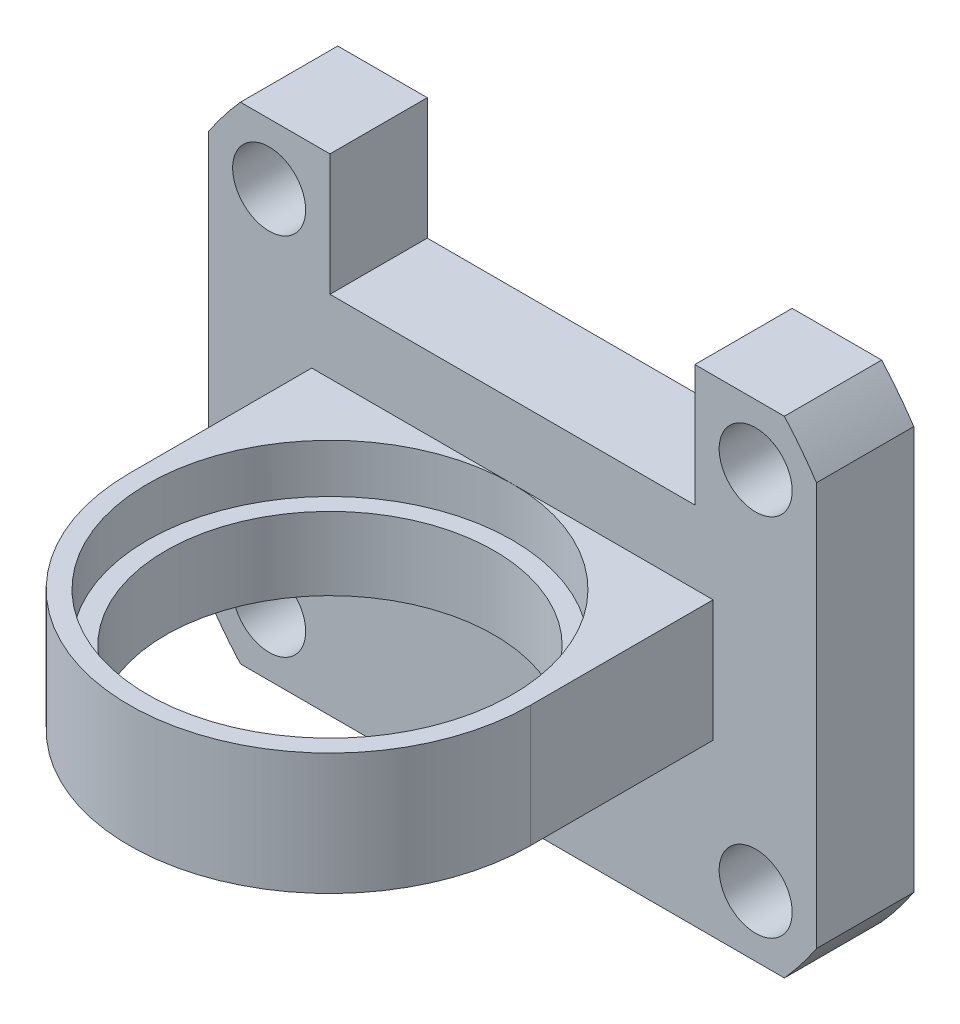
ISO-10303-21;
HEADER;
FILE_DESCRIPTION(('STEP AP214'),'2;1');
FILE_NAME('part.step','',(''),(''),'','','');
FILE_SCHEMA(('AUTOMOTIVE_DESIGN { 1 0 10303 214 1 1 1 1 }'));
ENDSEC;
DATA;
#1=APPLICATION_CONTEXT('core data for automotive mechanical design processes');
#2=APPLICATION_PROTOCOL_DEFINITION('international standard','automotive_design',2000,#1);
#3=PRODUCT_CONTEXT('',#1,'mechanical');
#4=PRODUCT('Part','Part','',(#3));
#5=PRODUCT_RELATED_PRODUCT_CATEGORY('part','',(#4));
#6=PRODUCT_DEFINITION_FORMATION('','',#4);
#7=PRODUCT_DEFINITION_CONTEXT('part definition',#1,'design');
#8=PRODUCT_DEFINITION('design','',#6,#7);
#9=PRODUCT_DEFINITION_SHAPE('','',#8);
#10=(LENGTH_UNIT() NAMED_UNIT(*) SI_UNIT(.MILLI.,.METRE.));
#11=(NAMED_UNIT(*) PLANE_ANGLE_UNIT() SI_UNIT($,.RADIAN.));
#12=(NAMED_UNIT(*) SI_UNIT($,.STERADIAN.) SOLID_ANGLE_UNIT());
#13=UNCERTAINTY_MEASURE_WITH_UNIT(LENGTH_MEASURE(1.E-05),#10,'distance_accuracy_value','');
#14=(GEOMETRIC_REPRESENTATION_CONTEXT(3) GLOBAL_UNCERTAINTY_ASSIGNED_CONTEXT((#13)) GLOBAL_UNIT_ASSIGNED_CONTEXT((#10,
#11,#12)) REPRESENTATION_CONTEXT('',''));
#15=CARTESIAN_POINT('',(0.,0.,0.));
#16=DIRECTION('',(0.,0.,1.));
#17=DIRECTION('',(1.,0.,0.));
#18=AXIS2_PLACEMENT_3D('',#15,#16,#17);
#19=CARTESIAN_POINT('',(0.,0.,8.));
#20=DIRECTION('',(0.,0.,1.));
#21=DIRECTION('',(1.,0.,0.));
#22=AXIS2_PLACEMENT_3D('',#19,#20,#21);
#23=PLANE('',#22);
#24=CARTESIAN_POINT('',(20.,15.,8.));
#25=DIRECTION('',(0.,0.,1.));
#26=DIRECTION('',(1.,0.,0.));
#27=AXIS2_PLACEMENT_3D('',#24,#25,#26);
#28=CIRCLE('',#27,3.);
#29=CARTESIAN_POINT('',(23.,15.,8.));
#30=VERTEX_POINT('',#29);
#31=EDGE_CURVE('E303',#30,#30,#28,.T.);
#32=ORIENTED_EDGE('',*,*,#31,.F.);
#33=EDGE_LOOP('',(#32));
#34=FACE_BOUND('',#33,.T.);
#35=CARTESIAN_POINT('',(20.,-15.,8.));
#36=DIRECTION('',(0.,0.,1.));
#37=DIRECTION('',(1.,0.,0.));
#38=AXIS2_PLACEMENT_3D('',#35,#36,#37);
#39=CIRCLE('',#38,3.);
#40=CARTESIAN_POINT('',(23.,-15.,8.));
#41=VERTEX_POINT('',#40);
#42=EDGE_CURVE('E308',#41,#41,#39,.T.);
#43=ORIENTED_EDGE('',*,*,#42,.F.);
#44=EDGE_LOOP('',(#43));
#45=FACE_BOUND('',#44,.T.);
#46=CARTESIAN_POINT('',(-20.,-15.,8.));
#47=DIRECTION('',(0.,0.,1.));
#48=DIRECTION('',(1.,0.,0.));
#49=AXIS2_PLACEMENT_3D('',#46,#47,#48);
#50=CIRCLE('',#49,3.);
#51=CARTESIAN_POINT('',(-17.,-15.,8.));
#52=VERTEX_POINT('',#51);
#53=EDGE_CURVE('E304',#52,#52,#50,.T.);
#54=ORIENTED_EDGE('',*,*,#53,.F.);
#55=EDGE_LOOP('',(#54));
#56=FACE_BOUND('',#55,.T.);
#57=CARTESIAN_POINT('',(-20.,15.,8.));
#58=DIRECTION('',(0.,0.,1.));
#59=DIRECTION('',(1.,0.,0.));
#60=AXIS2_PLACEMENT_3D('',#57,#58,#59);
#61=CIRCLE('',#60,3.);
#62=CARTESIAN_POINT('',(-17.,15.,8.));
#63=VERTEX_POINT('',#62);
#64=EDGE_CURVE('E241',#63,#63,#61,.T.);
#65=ORIENTED_EDGE('',*,*,#64,.F.);
#66=EDGE_LOOP('',(#65));
#67=FACE_BOUND('',#66,.T.);
#68=DIRECTION('',(-1.,0.,0.));
#69=VECTOR('',#68,1.);
#70=CARTESIAN_POINT('',(0.,-6.,8.));
#71=LINE('',#70,#69);
#72=CARTESIAN_POINT('',(16.5,-6.,8.));
#73=VERTEX_POINT('',#72);
#74=CARTESIAN_POINT('',(-16.5,-6.,8.));
#75=VERTEX_POINT('',#74);
#76=EDGE_CURVE('E256',#73,#75,#71,.T.);
#77=ORIENTED_EDGE('',*,*,#76,.T.);
#78=DIRECTION('',(0.,-1.,0.));
#79=VECTOR('',#78,1.);
#80=CARTESIAN_POINT('',(-16.5,0.,8.));
#81=LINE('',#80,#79);
#82=CARTESIAN_POINT('',(-16.5,4.,8.));
#83=VERTEX_POINT('',#82);
#84=EDGE_CURVE('E250',#83,#75,#81,.T.);
#85=ORIENTED_EDGE('',*,*,#84,.F.);
#86=DIRECTION('',(-1.,0.,0.));
#87=VECTOR('',#86,1.);
#88=CARTESIAN_POINT('',(0.,4.,8.));
#89=LINE('',#88,#87);
#90=CARTESIAN_POINT('',(0.,4.,8.));
#91=VERTEX_POINT('',#90);
#92=EDGE_CURVE('E253',#91,#83,#89,.T.);
#93=ORIENTED_EDGE('',*,*,#92,.F.);
#94=CARTESIAN_POINT('',(16.5,4.,8.));
#95=VERTEX_POINT('',#94);
#96=EDGE_CURVE('E255',#95,#91,#89,.T.);
#97=ORIENTED_EDGE('',*,*,#96,.F.);
#98=DIRECTION('',(0.,1.,0.));
#99=VECTOR('',#98,1.);
#100=CARTESIAN_POINT('',(16.5,0.,8.));
#101=LINE('',#100,#99);
#102=EDGE_CURVE('E235',#73,#95,#101,.T.);
#103=ORIENTED_EDGE('',*,*,#102,.F.);
#104=EDGE_LOOP('',(#77,#85,#93,#97,#103));
#105=FACE_BOUND('',#104,.T.);
#106=CARTESIAN_POINT('',(0.,0.,8.));
#107=DIRECTION('',(0.,0.,1.));
#108=DIRECTION('',(1.,0.,0.));
#109=AXIS2_PLACEMENT_3D('',#106,#107,#108);
#110=CIRCLE('',#109,30.);
#111=CARTESIAN_POINT('',(25.,-16.583123951777,8.));
#112=VERTEX_POINT('',#111);
#113=CARTESIAN_POINT('',(22.3606797749979,-20.,8.));
#114=VERTEX_POINT('',#113);
#115=EDGE_CURVE('E346',#112,#114,#110,.F.);
#116=ORIENTED_EDGE('',*,*,#115,.F.);
#117=DIRECTION('',(0.,1.,0.));
#118=VECTOR('',#117,1.);
#119=CARTESIAN_POINT('',(25.,-20.,8.));
#120=LINE('',#119,#118);
#121=CARTESIAN_POINT('',(25.,16.583123951777,8.));
#122=VERTEX_POINT('',#121);
#123=EDGE_CURVE('E197',#112,#122,#120,.T.);
#124=ORIENTED_EDGE('',*,*,#123,.T.);
#125=CARTESIAN_POINT('',(22.3606797749979,20.,8.));
#126=VERTEX_POINT('',#125);
#127=EDGE_CURVE('E180',#126,#122,#110,.F.);
#128=ORIENTED_EDGE('',*,*,#127,.F.);
#129=DIRECTION('',(-1.,0.,0.));
#130=VECTOR('',#129,1.);
#131=CARTESIAN_POINT('',(15.,20.,8.));
#132=LINE('',#131,#130);
#133=CARTESIAN_POINT('',(15.,20.,8.));
#134=VERTEX_POINT('',#133);
#135=EDGE_CURVE('E177',#126,#134,#132,.T.);
#136=ORIENTED_EDGE('',*,*,#135,.T.);
#137=DIRECTION('',(0.,-1.,0.));
#138=VECTOR('',#137,1.);
#139=CARTESIAN_POINT('',(15.,10.,8.));
#140=LINE('',#139,#138);
#141=CARTESIAN_POINT('',(15.,10.,8.));
#142=VERTEX_POINT('',#141);
#143=EDGE_CURVE('E320',#134,#142,#140,.T.);
#144=ORIENTED_EDGE('',*,*,#143,.T.);
#145=DIRECTION('',(-1.,0.,0.));
#146=VECTOR('',#145,1.);
#147=CARTESIAN_POINT('',(-15.,10.,8.));
#148=LINE('',#147,#146);
#149=CARTESIAN_POINT('',(-15.,10.,8.));
#150=VERTEX_POINT('',#149);
#151=EDGE_CURVE('E323',#142,#150,#148,.T.);
#152=ORIENTED_EDGE('',*,*,#151,.T.);
#153=DIRECTION('',(0.,1.,0.));
#154=VECTOR('',#153,1.);
#155=CARTESIAN_POINT('',(-15.,20.,8.));
#156=LINE('',#155,#154);
#157=CARTESIAN_POINT('',(-15.,20.,8.));
#158=VERTEX_POINT('',#157);
#159=EDGE_CURVE('E326',#150,#158,#156,.T.);
#160=ORIENTED_EDGE('',*,*,#159,.T.);
#161=DIRECTION('',(-1.,0.,0.));
#162=VECTOR('',#161,1.);
#163=CARTESIAN_POINT('',(-25.,20.,8.));
#164=LINE('',#163,#162);
#165=CARTESIAN_POINT('',(-22.3606797749979,20.,8.));
#166=VERTEX_POINT('',#165);
#167=EDGE_CURVE('E329',#158,#166,#164,.T.);
#168=ORIENTED_EDGE('',*,*,#167,.T.);
#169=CARTESIAN_POINT('',(-25.,16.583123951777,8.));
#170=VERTEX_POINT('',#169);
#171=EDGE_CURVE('E369',#170,#166,#110,.F.);
#172=ORIENTED_EDGE('',*,*,#171,.F.);
#173=DIRECTION('',(0.,-1.,0.));
#174=VECTOR('',#173,1.);
#175=CARTESIAN_POINT('',(-25.,-20.,8.));
#176=LINE('',#175,#174);
#177=CARTESIAN_POINT('',(-25.,-16.583123951777,8.));
#178=VERTEX_POINT('',#177);
#179=EDGE_CURVE('E333',#170,#178,#176,.T.);
#180=ORIENTED_EDGE('',*,*,#179,.T.);
#181=CARTESIAN_POINT('',(-22.3606797749979,-20.,8.));
#182=VERTEX_POINT('',#181);
#183=EDGE_CURVE('E356',#182,#178,#110,.F.);
#184=ORIENTED_EDGE('',*,*,#183,.F.);
#185=DIRECTION('',(1.,0.,0.));
#186=VECTOR('',#185,1.);
#187=CARTESIAN_POINT('',(-25.,-20.,8.));
#188=LINE('',#187,#186);
#189=EDGE_CURVE('E336',#182,#114,#188,.T.);
#190=ORIENTED_EDGE('',*,*,#189,.T.);
#191=EDGE_LOOP('',(#116,#124,#128,#136,#144,#152,#160,#168,#172,#180,#184,#190));
#192=FACE_BOUND('',#191,.T.);
#193=ADVANCED_FACE('F41',(#34,#45,#56,#67,#105,#192),#23,.T.);
#194=CARTESIAN_POINT('',(0.,0.,0.));
#195=DIRECTION('',(0.,0.,1.));
#196=DIRECTION('',(1.,0.,0.));
#197=AXIS2_PLACEMENT_3D('',#194,#195,#196);
#198=PLANE('',#197);
#199=CARTESIAN_POINT('',(20.,15.,0.));
#200=DIRECTION('',(0.,0.,1.));
#201=DIRECTION('',(1.,0.,0.));
#202=AXIS2_PLACEMENT_3D('',#199,#200,#201);
#203=CIRCLE('',#202,3.);
#204=CARTESIAN_POINT('',(23.,15.,0.));
#205=VERTEX_POINT('',#204);
#206=EDGE_CURVE('E187',#205,#205,#203,.T.);
#207=ORIENTED_EDGE('',*,*,#206,.T.);
#208=EDGE_LOOP('',(#207));
#209=FACE_BOUND('',#208,.T.);
#210=CARTESIAN_POINT('',(20.,-15.,0.));
#211=DIRECTION('',(0.,0.,1.));
#212=DIRECTION('',(1.,0.,0.));
#213=AXIS2_PLACEMENT_3D('',#210,#211,#212);
#214=CIRCLE('',#213,3.);
#215=CARTESIAN_POINT('',(23.,-15.,0.));
#216=VERTEX_POINT('',#215);
#217=EDGE_CURVE('E194',#216,#216,#214,.T.);
#218=ORIENTED_EDGE('',*,*,#217,.T.);
#219=EDGE_LOOP('',(#218));
#220=FACE_BOUND('',#219,.T.);
#221=CARTESIAN_POINT('',(-20.,-15.,0.));
#222=DIRECTION('',(0.,0.,1.));
#223=DIRECTION('',(1.,0.,0.));
#224=AXIS2_PLACEMENT_3D('',#221,#222,#223);
#225=CIRCLE('',#224,3.);
#226=CARTESIAN_POINT('',(-17.,-15.,0.));
#227=VERTEX_POINT('',#226);
#228=EDGE_CURVE('E240',#227,#227,#225,.T.);
#229=ORIENTED_EDGE('',*,*,#228,.T.);
#230=EDGE_LOOP('',(#229));
#231=FACE_BOUND('',#230,.T.);
#232=CARTESIAN_POINT('',(-20.,15.,0.));
#233=DIRECTION('',(0.,0.,1.));
#234=DIRECTION('',(1.,0.,0.));
#235=AXIS2_PLACEMENT_3D('',#232,#233,#234);
#236=CIRCLE('',#235,3.);
#237=CARTESIAN_POINT('',(-17.,15.,0.));
#238=VERTEX_POINT('',#237);
#239=EDGE_CURVE('E236',#238,#238,#236,.T.);
#240=ORIENTED_EDGE('',*,*,#239,.T.);
#241=EDGE_LOOP('',(#240));
#242=FACE_BOUND('',#241,.T.);
#243=DIRECTION('',(0.,1.,0.));
#244=VECTOR('',#243,1.);
#245=CARTESIAN_POINT('',(25.,-20.,0.));
#246=LINE('',#245,#244);
#247=CARTESIAN_POINT('',(25.,-16.583123951777,0.));
#248=VERTEX_POINT('',#247);
#249=CARTESIAN_POINT('',(25.,16.583123951777,0.));
#250=VERTEX_POINT('',#249);
#251=EDGE_CURVE('E217',#248,#250,#246,.T.);
#252=ORIENTED_EDGE('',*,*,#251,.F.);
#253=CARTESIAN_POINT('',(0.,0.,0.));
#254=DIRECTION('',(0.,0.,1.));
#255=DIRECTION('',(1.,0.,0.));
#256=AXIS2_PLACEMENT_3D('',#253,#254,#255);
#257=CIRCLE('',#256,30.);
#258=CARTESIAN_POINT('',(22.3606797749979,-20.,0.));
#259=VERTEX_POINT('',#258);
#260=EDGE_CURVE('E12',#248,#259,#257,.F.);
#261=ORIENTED_EDGE('',*,*,#260,.T.);
#262=DIRECTION('',(1.,0.,0.));
#263=VECTOR('',#262,1.);
#264=CARTESIAN_POINT('',(-25.,-20.,0.));
#265=LINE('',#264,#263);
#266=CARTESIAN_POINT('',(-22.3606797749979,-20.,0.));
#267=VERTEX_POINT('',#266);
#268=EDGE_CURVE('E213',#267,#259,#265,.T.);
#269=ORIENTED_EDGE('',*,*,#268,.F.);
#270=CARTESIAN_POINT('',(-25.,-16.583123951777,0.));
#271=VERTEX_POINT('',#270);
#272=EDGE_CURVE('E50',#267,#271,#257,.F.);
#273=ORIENTED_EDGE('',*,*,#272,.T.);
#274=DIRECTION('',(0.,-1.,0.));
#275=VECTOR('',#274,1.);
#276=CARTESIAN_POINT('',(-25.,-20.,0.));
#277=LINE('',#276,#275);
#278=CARTESIAN_POINT('',(-25.,16.583123951777,0.));
#279=VERTEX_POINT('',#278);
#280=EDGE_CURVE('E209',#279,#271,#277,.T.);
#281=ORIENTED_EDGE('',*,*,#280,.F.);
#282=CARTESIAN_POINT('',(-22.3606797749979,20.,0.));
#283=VERTEX_POINT('',#282);
#284=EDGE_CURVE('E51',#279,#283,#257,.F.);
#285=ORIENTED_EDGE('',*,*,#284,.T.);
#286=DIRECTION('',(-1.,0.,0.));
#287=VECTOR('',#286,1.);
#288=CARTESIAN_POINT('',(-25.,20.,0.));
#289=LINE('',#288,#287);
#290=CARTESIAN_POINT('',(-15.,20.,0.));
#291=VERTEX_POINT('',#290);
#292=EDGE_CURVE('E205',#291,#283,#289,.T.);
#293=ORIENTED_EDGE('',*,*,#292,.F.);
#294=DIRECTION('',(0.,1.,0.));
#295=VECTOR('',#294,1.);
#296=CARTESIAN_POINT('',(-15.,20.,0.));
#297=LINE('',#296,#295);
#298=CARTESIAN_POINT('',(-15.,10.,0.));
#299=VERTEX_POINT('',#298);
#300=EDGE_CURVE('E202',#299,#291,#297,.T.);
#301=ORIENTED_EDGE('',*,*,#300,.F.);
#302=DIRECTION('',(-1.,0.,0.));
#303=VECTOR('',#302,1.);
#304=CARTESIAN_POINT('',(-15.,10.,0.));
#305=LINE('',#304,#303);
#306=CARTESIAN_POINT('',(15.,10.,0.));
#307=VERTEX_POINT('',#306);
#308=EDGE_CURVE('E191',#307,#299,#305,.T.);
#309=ORIENTED_EDGE('',*,*,#308,.F.);
#310=DIRECTION('',(0.,-1.,0.));
#311=VECTOR('',#310,1.);
#312=CARTESIAN_POINT('',(15.,10.,0.));
#313=LINE('',#312,#311);
#314=CARTESIAN_POINT('',(15.,20.,0.));
#315=VERTEX_POINT('',#314);
#316=EDGE_CURVE('E184',#315,#307,#313,.T.);
#317=ORIENTED_EDGE('',*,*,#316,.F.);
#318=DIRECTION('',(-1.,0.,0.));
#319=VECTOR('',#318,1.);
#320=CARTESIAN_POINT('',(15.,20.,0.));
#321=LINE('',#320,#319);
#322=CARTESIAN_POINT('',(22.3606797749979,20.,0.));
#323=VERTEX_POINT('',#322);
#324=EDGE_CURVE('E175',#323,#315,#321,.T.);
#325=ORIENTED_EDGE('',*,*,#324,.F.);
#326=CARTESIAN_POINT('',(0.,0.,0.));
#327=DIRECTION('',(0.,0.,1.));
#328=DIRECTION('',(1.,0.,0.));
#329=AXIS2_PLACEMENT_3D('',#326,#327,#328);
#330=CIRCLE('',#329,30.);
#331=EDGE_CURVE('E158',#250,#323,#330,.T.);
#332=ORIENTED_EDGE('',*,*,#331,.F.);
#333=EDGE_LOOP('',(#252,#261,#269,#273,#281,#285,#293,#301,#309,#317,#325,#332));
#334=FACE_BOUND('',#333,.T.);
#335=ADVANCED_FACE('F182',(#209,#220,#231,#242,#334),#198,.F.);
#336=CARTESIAN_POINT('',(15.,20.,8.));
#337=DIRECTION('',(0.,-1.,0.));
#338=DIRECTION('',(1.,0.,0.));
#339=AXIS2_PLACEMENT_3D('',#336,#337,#338);
#340=PLANE('',#339);
#341=ORIENTED_EDGE('',*,*,#135,.F.);
#342=DIRECTION('',(0.,0.,-1.));
#343=VECTOR('',#342,1.);
#344=CARTESIAN_POINT('',(22.3606797749979,20.,39.5));
#345=LINE('',#344,#343);
#346=EDGE_CURVE('E161',#126,#323,#345,.T.);
#347=ORIENTED_EDGE('',*,*,#346,.T.);
#348=ORIENTED_EDGE('',*,*,#324,.T.);
#349=DIRECTION('',(0.,0.,-1.));
#350=VECTOR('',#349,1.);
#351=CARTESIAN_POINT('',(15.,20.,8.));
#352=LINE('',#351,#350);
#353=EDGE_CURVE('E232',#134,#315,#352,.T.);
#354=ORIENTED_EDGE('',*,*,#353,.F.);
#355=EDGE_LOOP('',(#341,#347,#348,#354));
#356=FACE_BOUND('',#355,.T.);
#357=ADVANCED_FACE('F43',(#356),#340,.F.);
#358=CARTESIAN_POINT('',(15.,10.,8.));
#359=DIRECTION('',(1.,0.,0.));
#360=DIRECTION('',(0.,1.,0.));
#361=AXIS2_PLACEMENT_3D('',#358,#359,#360);
#362=PLANE('',#361);
#363=ORIENTED_EDGE('',*,*,#316,.T.);
#364=DIRECTION('',(0.,0.,-1.));
#365=VECTOR('',#364,1.);
#366=CARTESIAN_POINT('',(15.,10.,8.));
#367=LINE('',#366,#365);
#368=EDGE_CURVE('E228',#142,#307,#367,.T.);
#369=ORIENTED_EDGE('',*,*,#368,.F.);
#370=ORIENTED_EDGE('',*,*,#143,.F.);
#371=ORIENTED_EDGE('',*,*,#353,.T.);
#372=EDGE_LOOP('',(#363,#369,#370,#371));
#373=FACE_BOUND('',#372,.T.);
#374=ADVANCED_FACE('F434',(#373),#362,.F.);
#375=CARTESIAN_POINT('',(-15.,10.,8.));
#376=DIRECTION('',(0.,-1.,0.));
#377=DIRECTION('',(1.,0.,0.));
#378=AXIS2_PLACEMENT_3D('',#375,#376,#377);
#379=PLANE('',#378);
#380=ORIENTED_EDGE('',*,*,#308,.T.);
#381=DIRECTION('',(0.,0.,-1.));
#382=VECTOR('',#381,1.);
#383=CARTESIAN_POINT('',(-15.,10.,8.));
#384=LINE('',#383,#382);
#385=EDGE_CURVE('E224',#150,#299,#384,.T.);
#386=ORIENTED_EDGE('',*,*,#385,.F.);
#387=ORIENTED_EDGE('',*,*,#151,.F.);
#388=ORIENTED_EDGE('',*,*,#368,.T.);
#389=EDGE_LOOP('',(#380,#386,#387,#388));
#390=FACE_BOUND('',#389,.T.);
#391=ADVANCED_FACE('F431',(#390),#379,.F.);
#392=CARTESIAN_POINT('',(-15.,20.,8.));
#393=DIRECTION('',(-1.,0.,0.));
#394=DIRECTION('',(0.,-1.,0.));
#395=AXIS2_PLACEMENT_3D('',#392,#393,#394);
#396=PLANE('',#395);
#397=ORIENTED_EDGE('',*,*,#300,.T.);
#398=DIRECTION('',(0.,0.,-1.));
#399=VECTOR('',#398,1.);
#400=CARTESIAN_POINT('',(-15.,20.,8.));
#401=LINE('',#400,#399);
#402=EDGE_CURVE('E220',#158,#291,#401,.T.);
#403=ORIENTED_EDGE('',*,*,#402,.F.);
#404=ORIENTED_EDGE('',*,*,#159,.F.);
#405=ORIENTED_EDGE('',*,*,#385,.T.);
#406=EDGE_LOOP('',(#397,#403,#404,#405));
#407=FACE_BOUND('',#406,.T.);
#408=ADVANCED_FACE('F427',(#407),#396,.F.);
#409=CARTESIAN_POINT('',(-25.,20.,8.));
#410=DIRECTION('',(0.,-1.,0.));
#411=DIRECTION('',(0.,0.,-1.));
#412=AXIS2_PLACEMENT_3D('',#409,#410,#411);
#413=PLANE('',#412);
#414=ORIENTED_EDGE('',*,*,#292,.T.);
#415=DIRECTION('',(0.,0.,-1.));
#416=VECTOR('',#415,1.);
#417=CARTESIAN_POINT('',(-22.3606797749979,20.,39.5));
#418=LINE('',#417,#416);
#419=EDGE_CURVE('E58',#283,#166,#418,.F.);
#420=ORIENTED_EDGE('',*,*,#419,.T.);
#421=ORIENTED_EDGE('',*,*,#167,.F.);
#422=ORIENTED_EDGE('',*,*,#402,.T.);
#423=EDGE_LOOP('',(#414,#420,#421,#422));
#424=FACE_BOUND('',#423,.T.);
#425=ADVANCED_FACE('F423',(#424),#413,.F.);
#426=CARTESIAN_POINT('',(-25.,-20.,8.));
#427=DIRECTION('',(1.,0.,0.));
#428=DIRECTION('',(0.,0.,-1.));
#429=AXIS2_PLACEMENT_3D('',#426,#427,#428);
#430=PLANE('',#429);
#431=ORIENTED_EDGE('',*,*,#280,.T.);
#432=DIRECTION('',(0.,0.,-1.));
#433=VECTOR('',#432,1.);
#434=CARTESIAN_POINT('',(-25.,-16.583123951777,39.5));
#435=LINE('',#434,#433);
#436=EDGE_CURVE('E66',#271,#178,#435,.F.);
#437=ORIENTED_EDGE('',*,*,#436,.T.);
#438=ORIENTED_EDGE('',*,*,#179,.F.);
#439=DIRECTION('',(0.,0.,-1.));
#440=VECTOR('',#439,1.);
#441=CARTESIAN_POINT('',(-25.,16.583123951777,39.5));
#442=LINE('',#441,#440);
#443=EDGE_CURVE('E365',#170,#279,#442,.T.);
#444=ORIENTED_EDGE('',*,*,#443,.T.);
#445=EDGE_LOOP('',(#431,#437,#438,#444));
#446=FACE_BOUND('',#445,.T.);
#447=ADVANCED_FACE('F419',(#446),#430,.F.);
#448=CARTESIAN_POINT('',(-25.,-20.,8.));
#449=DIRECTION('',(0.,1.,0.));
#450=DIRECTION('',(0.,0.,1.));
#451=AXIS2_PLACEMENT_3D('',#448,#449,#450);
#452=PLANE('',#451);
#453=ORIENTED_EDGE('',*,*,#268,.T.);
#454=DIRECTION('',(0.,0.,-1.));
#455=VECTOR('',#454,1.);
#456=CARTESIAN_POINT('',(22.3606797749979,-20.,39.5));
#457=LINE('',#456,#455);
#458=EDGE_CURVE('E351',#259,#114,#457,.F.);
#459=ORIENTED_EDGE('',*,*,#458,.T.);
#460=ORIENTED_EDGE('',*,*,#189,.F.);
#461=DIRECTION('',(0.,0.,-1.));
#462=VECTOR('',#461,1.);
#463=CARTESIAN_POINT('',(-22.3606797749979,-20.,39.5));
#464=LINE('',#463,#462);
#465=EDGE_CURVE('E179',#182,#267,#464,.T.);
#466=ORIENTED_EDGE('',*,*,#465,.T.);
#467=EDGE_LOOP('',(#453,#459,#460,#466));
#468=FACE_BOUND('',#467,.T.);
#469=ADVANCED_FACE('F416',(#468),#452,.F.);
#470=CARTESIAN_POINT('',(25.,-20.,8.));
#471=DIRECTION('',(-1.,0.,0.));
#472=DIRECTION('',(0.,0.,1.));
#473=AXIS2_PLACEMENT_3D('',#470,#471,#472);
#474=PLANE('',#473);
#475=ORIENTED_EDGE('',*,*,#251,.T.);
#476=DIRECTION('',(0.,0.,-1.));
#477=VECTOR('',#476,1.);
#478=CARTESIAN_POINT('',(25.,16.583123951777,39.5));
#479=LINE('',#478,#477);
#480=EDGE_CURVE('E164',#250,#122,#479,.F.);
#481=ORIENTED_EDGE('',*,*,#480,.T.);
#482=ORIENTED_EDGE('',*,*,#123,.F.);
#483=DIRECTION('',(0.,0.,-1.));
#484=VECTOR('',#483,1.);
#485=CARTESIAN_POINT('',(25.,-16.583123951777,39.5));
#486=LINE('',#485,#484);
#487=EDGE_CURVE('E170',#112,#248,#486,.T.);
#488=ORIENTED_EDGE('',*,*,#487,.T.);
#489=EDGE_LOOP('',(#475,#481,#482,#488));
#490=FACE_BOUND('',#489,.T.);
#491=ADVANCED_FACE('F349',(#490),#474,.F.);
#492=CARTESIAN_POINT('',(-20.,15.,-1.2E-05));
#493=DIRECTION('',(0.,0.,1.));
#494=DIRECTION('',(1.,0.,0.));
#495=AXIS2_PLACEMENT_3D('',#492,#493,#494);
#496=CYLINDRICAL_SURFACE('',#495,3.);
#497=CARTESIAN_POINT('',(-17.,15.,8.));
#498=CARTESIAN_POINT('',(-17.,15.,7.91666666666667));
#499=CARTESIAN_POINT('',(-17.,15.,7.83333333333333));
#500=CARTESIAN_POINT('',(-17.,15.,7.66666666666667));
#501=CARTESIAN_POINT('',(-17.,15.,7.58333333333333));
#502=CARTESIAN_POINT('',(-17.,15.,7.41666666666667));
#503=CARTESIAN_POINT('',(-17.,15.,7.33333333333333));
#504=CARTESIAN_POINT('',(-17.,15.,7.16666666666667));
#505=CARTESIAN_POINT('',(-17.,15.,7.08333333333333));
#506=CARTESIAN_POINT('',(-17.,15.,6.91666666666667));
#507=CARTESIAN_POINT('',(-17.,15.,6.83333333333333));
#508=CARTESIAN_POINT('',(-17.,15.,6.66666666666667));
#509=CARTESIAN_POINT('',(-17.,15.,6.58333333333333));
#510=CARTESIAN_POINT('',(-17.,15.,6.41666666666667));
#511=CARTESIAN_POINT('',(-17.,15.,6.33333333333333));
#512=CARTESIAN_POINT('',(-17.,15.,6.16666666666667));
#513=CARTESIAN_POINT('',(-17.,15.,6.08333333333333));
#514=CARTESIAN_POINT('',(-17.,15.,5.91666666666667));
#515=CARTESIAN_POINT('',(-17.,15.,5.83333333333333));
#516=CARTESIAN_POINT('',(-17.,15.,5.66666666666667));
#517=CARTESIAN_POINT('',(-17.,15.,5.58333333333333));
#518=CARTESIAN_POINT('',(-17.,15.,5.41666666666667));
#519=CARTESIAN_POINT('',(-17.,15.,5.33333333333333));
#520=CARTESIAN_POINT('',(-17.,15.,5.16666666666667));
#521=CARTESIAN_POINT('',(-17.,15.,5.08333333333333));
#522=CARTESIAN_POINT('',(-17.,15.,4.91666666666667));
#523=CARTESIAN_POINT('',(-17.,15.,4.83333333333333));
#524=CARTESIAN_POINT('',(-17.,15.,4.66666666666667));
#525=CARTESIAN_POINT('',(-17.,15.,4.58333333333333));
#526=CARTESIAN_POINT('',(-17.,15.,4.41666666666667));
#527=CARTESIAN_POINT('',(-17.,15.,4.33333333333333));
#528=CARTESIAN_POINT('',(-17.,15.,4.16666666666667));
#529=CARTESIAN_POINT('',(-17.,15.,4.08333333333333));
#530=CARTESIAN_POINT('',(-17.,15.,3.91666666666667));
#531=CARTESIAN_POINT('',(-17.,15.,3.83333333333333));
#532=CARTESIAN_POINT('',(-17.,15.,3.66666666666667));
#533=CARTESIAN_POINT('',(-17.,15.,3.58333333333333));
#534=CARTESIAN_POINT('',(-17.,15.,3.41666666666667));
#535=CARTESIAN_POINT('',(-17.,15.,3.33333333333333));
#536=CARTESIAN_POINT('',(-17.,15.,3.16666666666667));
#537=CARTESIAN_POINT('',(-17.,15.,3.08333333333333));
#538=CARTESIAN_POINT('',(-17.,15.,2.91666666666667));
#539=CARTESIAN_POINT('',(-17.,15.,2.83333333333333));
#540=CARTESIAN_POINT('',(-17.,15.,2.66666666666667));
#541=CARTESIAN_POINT('',(-17.,15.,2.58333333333333));
#542=CARTESIAN_POINT('',(-17.,15.,2.41666666666667));
#543=CARTESIAN_POINT('',(-17.,15.,2.33333333333333));
#544=CARTESIAN_POINT('',(-17.,15.,2.16666666666667));
#545=CARTESIAN_POINT('',(-17.,15.,2.08333333333333));
#546=CARTESIAN_POINT('',(-17.,15.,1.91666666666667));
#547=CARTESIAN_POINT('',(-17.,15.,1.83333333333333));
#548=CARTESIAN_POINT('',(-17.,15.,1.66666666666667));
#549=CARTESIAN_POINT('',(-17.,15.,1.58333333333333));
#550=CARTESIAN_POINT('',(-17.,15.,1.41666666666667));
#551=CARTESIAN_POINT('',(-17.,15.,1.33333333333333));
#552=CARTESIAN_POINT('',(-17.,15.,1.16666666666667));
#553=CARTESIAN_POINT('',(-17.,15.,1.08333333333333));
#554=CARTESIAN_POINT('',(-17.,15.,0.916666666666667));
#555=CARTESIAN_POINT('',(-17.,15.,0.833333333333334));
#556=CARTESIAN_POINT('',(-17.,15.,0.666666666666667));
#557=CARTESIAN_POINT('',(-17.,15.,0.583333333333334));
#558=CARTESIAN_POINT('',(-17.,15.,0.416666666666668));
#559=CARTESIAN_POINT('',(-17.,15.,0.333333333333334));
#560=CARTESIAN_POINT('',(-17.,15.,0.166666666666667));
#561=CARTESIAN_POINT('',(-17.,15.,0.0833333333333339));
#562=CARTESIAN_POINT('',(-17.,15.,0.));
#563=B_SPLINE_CURVE_WITH_KNOTS('',3,(#497,#498,#499,#500,#501,#502,#503,#504,#505,#506,#507,
#508,#509,#510,#511,#512,#513,#514,#515,#516,#517,#518,#519,#520,#521,#522,#523,#524,#525,#526,
#527,#528,#529,#530,#531,#532,#533,#534,#535,#536,#537,#538,#539,#540,#541,#542,#543,#544,#545,
#546,#547,#548,#549,#550,#551,#552,#553,#554,#555,#556,#557,#558,#559,#560,#561,#562),
.UNSPECIFIED.,.F.,.F.,(4,2,2,2,2,2,2,2,2,2,2,2,2,2,2,2,2,2,2,2,2,2,2,2,2,2,2,2,2,2,2,2,4),(0.,
0.249999999999999,0.499999999999999,0.749999999999998,0.999999999999998,1.25,1.5,1.75,2.,2.25,
2.5,2.75,3.,3.25,3.5,3.75,4.,4.25,4.5,4.75,5.,5.25,5.5,5.75,6.,6.25,6.5,6.75,7.,7.25,7.5,7.75,
8.),.UNSPECIFIED.);
#564=EDGE_CURVE('BSEAM411',#63,#238,#563,.T.);
#565=ORIENTED_EDGE('',*,*,#64,.T.);
#566=ORIENTED_EDGE('',*,*,#239,.F.);
#567=ORIENTED_EDGE('',*,*,#564,.T.);
#568=ORIENTED_EDGE('',*,*,#564,.F.);
#569=EDGE_LOOP('',(#565,#567,#566,#568));
#570=FACE_BOUND('',#569,.T.);
#571=ADVANCED_FACE('F411',(#570),#496,.F.);
#572=CARTESIAN_POINT('',(-20.,-15.,-1.2E-05));
#573=DIRECTION('',(0.,0.,1.));
#574=DIRECTION('',(1.,0.,0.));
#575=AXIS2_PLACEMENT_3D('',#572,#573,#574);
#576=CYLINDRICAL_SURFACE('',#575,3.);
#577=CARTESIAN_POINT('',(-17.,-15.,8.));
#578=CARTESIAN_POINT('',(-17.,-15.,7.91666666666667));
#579=CARTESIAN_POINT('',(-17.,-15.,7.83333333333333));
#580=CARTESIAN_POINT('',(-17.,-15.,7.66666666666667));
#581=CARTESIAN_POINT('',(-17.,-15.,7.58333333333333));
#582=CARTESIAN_POINT('',(-17.,-15.,7.41666666666667));
#583=CARTESIAN_POINT('',(-17.,-15.,7.33333333333333));
#584=CARTESIAN_POINT('',(-17.,-15.,7.16666666666667));
#585=CARTESIAN_POINT('',(-17.,-15.,7.08333333333333));
#586=CARTESIAN_POINT('',(-17.,-15.,6.91666666666667));
#587=CARTESIAN_POINT('',(-17.,-15.,6.83333333333333));
#588=CARTESIAN_POINT('',(-17.,-15.,6.66666666666667));
#589=CARTESIAN_POINT('',(-17.,-15.,6.58333333333333));
#590=CARTESIAN_POINT('',(-17.,-15.,6.41666666666667));
#591=CARTESIAN_POINT('',(-17.,-15.,6.33333333333333));
#592=CARTESIAN_POINT('',(-17.,-15.,6.16666666666667));
#593=CARTESIAN_POINT('',(-17.,-15.,6.08333333333333));
#594=CARTESIAN_POINT('',(-17.,-15.,5.91666666666667));
#595=CARTESIAN_POINT('',(-17.,-15.,5.83333333333333));
#596=CARTESIAN_POINT('',(-17.,-15.,5.66666666666667));
#597=CARTESIAN_POINT('',(-17.,-15.,5.58333333333333));
#598=CARTESIAN_POINT('',(-17.,-15.,5.41666666666667));
#599=CARTESIAN_POINT('',(-17.,-15.,5.33333333333333));
#600=CARTESIAN_POINT('',(-17.,-15.,5.16666666666667));
#601=CARTESIAN_POINT('',(-17.,-15.,5.08333333333333));
#602=CARTESIAN_POINT('',(-17.,-15.,4.91666666666667));
#603=CARTESIAN_POINT('',(-17.,-15.,4.83333333333333));
#604=CARTESIAN_POINT('',(-17.,-15.,4.66666666666667));
#605=CARTESIAN_POINT('',(-17.,-15.,4.58333333333333));
#606=CARTESIAN_POINT('',(-17.,-15.,4.41666666666667));
#607=CARTESIAN_POINT('',(-17.,-15.,4.33333333333333));
#608=CARTESIAN_POINT('',(-17.,-15.,4.16666666666667));
#609=CARTESIAN_POINT('',(-17.,-15.,4.08333333333333));
#610=CARTESIAN_POINT('',(-17.,-15.,3.91666666666667));
#611=CARTESIAN_POINT('',(-17.,-15.,3.83333333333333));
#612=CARTESIAN_POINT('',(-17.,-15.,3.66666666666667));
#613=CARTESIAN_POINT('',(-17.,-15.,3.58333333333333));
#614=CARTESIAN_POINT('',(-17.,-15.,3.41666666666667));
#615=CARTESIAN_POINT('',(-17.,-15.,3.33333333333333));
#616=CARTESIAN_POINT('',(-17.,-15.,3.16666666666667));
#617=CARTESIAN_POINT('',(-17.,-15.,3.08333333333333));
#618=CARTESIAN_POINT('',(-17.,-15.,2.91666666666667));
#619=CARTESIAN_POINT('',(-17.,-15.,2.83333333333333));
#620=CARTESIAN_POINT('',(-17.,-15.,2.66666666666667));
#621=CARTESIAN_POINT('',(-17.,-15.,2.58333333333333));
#622=CARTESIAN_POINT('',(-17.,-15.,2.41666666666667));
#623=CARTESIAN_POINT('',(-17.,-15.,2.33333333333333));
#624=CARTESIAN_POINT('',(-17.,-15.,2.16666666666667));
#625=CARTESIAN_POINT('',(-17.,-15.,2.08333333333333));
#626=CARTESIAN_POINT('',(-17.,-15.,1.91666666666667));
#627=CARTESIAN_POINT('',(-17.,-15.,1.83333333333333));
#628=CARTESIAN_POINT('',(-17.,-15.,1.66666666666667));
#629=CARTESIAN_POINT('',(-17.,-15.,1.58333333333333));
#630=CARTESIAN_POINT('',(-17.,-15.,1.41666666666667));
#631=CARTESIAN_POINT('',(-17.,-15.,1.33333333333333));
#632=CARTESIAN_POINT('',(-17.,-15.,1.16666666666667));
#633=CARTESIAN_POINT('',(-17.,-15.,1.08333333333333));
#634=CARTESIAN_POINT('',(-17.,-15.,0.916666666666667));
#635=CARTESIAN_POINT('',(-17.,-15.,0.833333333333334));
#636=CARTESIAN_POINT('',(-17.,-15.,0.666666666666667));
#637=CARTESIAN_POINT('',(-17.,-15.,0.583333333333334));
#638=CARTESIAN_POINT('',(-17.,-15.,0.416666666666668));
#639=CARTESIAN_POINT('',(-17.,-15.,0.333333333333334));
#640=CARTESIAN_POINT('',(-17.,-15.,0.166666666666667));
#641=CARTESIAN_POINT('',(-17.,-15.,0.0833333333333339));
#642=CARTESIAN_POINT('',(-17.,-15.,0.));
#643=B_SPLINE_CURVE_WITH_KNOTS('',3,(#577,#578,#579,#580,#581,#582,#583,#584,#585,#586,#587,
#588,#589,#590,#591,#592,#593,#594,#595,#596,#597,#598,#599,#600,#601,#602,#603,#604,#605,#606,
#607,#608,#609,#610,#611,#612,#613,#614,#615,#616,#617,#618,#619,#620,#621,#622,#623,#624,#625,
#626,#627,#628,#629,#630,#631,#632,#633,#634,#635,#636,#637,#638,#639,#640,#641,#642),
.UNSPECIFIED.,.F.,.F.,(4,2,2,2,2,2,2,2,2,2,2,2,2,2,2,2,2,2,2,2,2,2,2,2,2,2,2,2,2,2,2,2,4),(0.,
0.249999999999999,0.499999999999999,0.749999999999998,0.999999999999998,1.25,1.5,1.75,2.,2.25,
2.5,2.75,3.,3.25,3.5,3.75,4.,4.25,4.5,4.75,5.,5.25,5.5,5.75,6.,6.25,6.5,6.75,7.,7.25,7.5,7.75,
8.),.UNSPECIFIED.);
#644=EDGE_CURVE('BSEAM498',#52,#227,#643,.T.);
#645=ORIENTED_EDGE('',*,*,#53,.T.);
#646=ORIENTED_EDGE('',*,*,#228,.F.);
#647=ORIENTED_EDGE('',*,*,#644,.T.);
#648=ORIENTED_EDGE('',*,*,#644,.F.);
#649=EDGE_LOOP('',(#645,#647,#646,#648));
#650=FACE_BOUND('',#649,.T.);
#651=ADVANCED_FACE('F498',(#650),#576,.F.);
#652=CARTESIAN_POINT('',(20.,-15.,-1.2E-05));
#653=DIRECTION('',(0.,0.,1.));
#654=DIRECTION('',(1.,0.,0.));
#655=AXIS2_PLACEMENT_3D('',#652,#653,#654);
#656=CYLINDRICAL_SURFACE('',#655,3.);
#657=CARTESIAN_POINT('',(23.,-15.,8.));
#658=CARTESIAN_POINT('',(23.,-15.,7.91666666666667));
#659=CARTESIAN_POINT('',(23.,-15.,7.83333333333333));
#660=CARTESIAN_POINT('',(23.,-15.,7.66666666666667));
#661=CARTESIAN_POINT('',(23.,-15.,7.58333333333333));
#662=CARTESIAN_POINT('',(23.,-15.,7.41666666666667));
#663=CARTESIAN_POINT('',(23.,-15.,7.33333333333333));
#664=CARTESIAN_POINT('',(23.,-15.,7.16666666666667));
#665=CARTESIAN_POINT('',(23.,-15.,7.08333333333333));
#666=CARTESIAN_POINT('',(23.,-15.,6.91666666666667));
#667=CARTESIAN_POINT('',(23.,-15.,6.83333333333333));
#668=CARTESIAN_POINT('',(23.,-15.,6.66666666666667));
#669=CARTESIAN_POINT('',(23.,-15.,6.58333333333333));
#670=CARTESIAN_POINT('',(23.,-15.,6.41666666666667));
#671=CARTESIAN_POINT('',(23.,-15.,6.33333333333333));
#672=CARTESIAN_POINT('',(23.,-15.,6.16666666666667));
#673=CARTESIAN_POINT('',(23.,-15.,6.08333333333333));
#674=CARTESIAN_POINT('',(23.,-15.,5.91666666666667));
#675=CARTESIAN_POINT('',(23.,-15.,5.83333333333333));
#676=CARTESIAN_POINT('',(23.,-15.,5.66666666666667));
#677=CARTESIAN_POINT('',(23.,-15.,5.58333333333333));
#678=CARTESIAN_POINT('',(23.,-15.,5.41666666666667));
#679=CARTESIAN_POINT('',(23.,-15.,5.33333333333333));
#680=CARTESIAN_POINT('',(23.,-15.,5.16666666666667));
#681=CARTESIAN_POINT('',(23.,-15.,5.08333333333333));
#682=CARTESIAN_POINT('',(23.,-15.,4.91666666666667));
#683=CARTESIAN_POINT('',(23.,-15.,4.83333333333333));
#684=CARTESIAN_POINT('',(23.,-15.,4.66666666666667));
#685=CARTESIAN_POINT('',(23.,-15.,4.58333333333333));
#686=CARTESIAN_POINT('',(23.,-15.,4.41666666666667));
#687=CARTESIAN_POINT('',(23.,-15.,4.33333333333333));
#688=CARTESIAN_POINT('',(23.,-15.,4.16666666666667));
#689=CARTESIAN_POINT('',(23.,-15.,4.08333333333333));
#690=CARTESIAN_POINT('',(23.,-15.,3.91666666666667));
#691=CARTESIAN_POINT('',(23.,-15.,3.83333333333333));
#692=CARTESIAN_POINT('',(23.,-15.,3.66666666666667));
#693=CARTESIAN_POINT('',(23.,-15.,3.58333333333333));
#694=CARTESIAN_POINT('',(23.,-15.,3.41666666666667));
#695=CARTESIAN_POINT('',(23.,-15.,3.33333333333333));
#696=CARTESIAN_POINT('',(23.,-15.,3.16666666666667));
#697=CARTESIAN_POINT('',(23.,-15.,3.08333333333333));
#698=CARTESIAN_POINT('',(23.,-15.,2.91666666666667));
#699=CARTESIAN_POINT('',(23.,-15.,2.83333333333333));
#700=CARTESIAN_POINT('',(23.,-15.,2.66666666666667));
#701=CARTESIAN_POINT('',(23.,-15.,2.58333333333333));
#702=CARTESIAN_POINT('',(23.,-15.,2.41666666666667));
#703=CARTESIAN_POINT('',(23.,-15.,2.33333333333333));
#704=CARTESIAN_POINT('',(23.,-15.,2.16666666666667));
#705=CARTESIAN_POINT('',(23.,-15.,2.08333333333333));
#706=CARTESIAN_POINT('',(23.,-15.,1.91666666666667));
#707=CARTESIAN_POINT('',(23.,-15.,1.83333333333333));
#708=CARTESIAN_POINT('',(23.,-15.,1.66666666666667));
#709=CARTESIAN_POINT('',(23.,-15.,1.58333333333333));
#710=CARTESIAN_POINT('',(23.,-15.,1.41666666666667));
#711=CARTESIAN_POINT('',(23.,-15.,1.33333333333333));
#712=CARTESIAN_POINT('',(23.,-15.,1.16666666666667));
#713=CARTESIAN_POINT('',(23.,-15.,1.08333333333333));
#714=CARTESIAN_POINT('',(23.,-15.,0.916666666666667));
#715=CARTESIAN_POINT('',(23.,-15.,0.833333333333334));
#716=CARTESIAN_POINT('',(23.,-15.,0.666666666666667));
#717=CARTESIAN_POINT('',(23.,-15.,0.583333333333334));
#718=CARTESIAN_POINT('',(23.,-15.,0.416666666666668));
#719=CARTESIAN_POINT('',(23.,-15.,0.333333333333334));
#720=CARTESIAN_POINT('',(23.,-15.,0.166666666666667));
#721=CARTESIAN_POINT('',(23.,-15.,0.0833333333333339));
#722=CARTESIAN_POINT('',(23.,-15.,0.));
#723=B_SPLINE_CURVE_WITH_KNOTS('',3,(#657,#658,#659,#660,#661,#662,#663,#664,#665,#666,#667,
#668,#669,#670,#671,#672,#673,#674,#675,#676,#677,#678,#679,#680,#681,#682,#683,#684,#685,#686,
#687,#688,#689,#690,#691,#692,#693,#694,#695,#696,#697,#698,#699,#700,#701,#702,#703,#704,#705,
#706,#707,#708,#709,#710,#711,#712,#713,#714,#715,#716,#717,#718,#719,#720,#721,#722),
.UNSPECIFIED.,.F.,.F.,(4,2,2,2,2,2,2,2,2,2,2,2,2,2,2,2,2,2,2,2,2,2,2,2,2,2,2,2,2,2,2,2,4),(0.,
0.249999999999999,0.499999999999999,0.749999999999998,0.999999999999998,1.25,1.5,1.75,2.,2.25,
2.5,2.75,3.,3.25,3.5,3.75,4.,4.25,4.5,4.75,5.,5.25,5.5,5.75,6.,6.25,6.5,6.75,7.,7.25,7.5,7.75,
8.),.UNSPECIFIED.);
#724=EDGE_CURVE('BSEAM501',#41,#216,#723,.T.);
#725=ORIENTED_EDGE('',*,*,#42,.T.);
#726=ORIENTED_EDGE('',*,*,#217,.F.);
#727=ORIENTED_EDGE('',*,*,#724,.T.);
#728=ORIENTED_EDGE('',*,*,#724,.F.);
#729=EDGE_LOOP('',(#725,#727,#726,#728));
#730=FACE_BOUND('',#729,.T.);
#731=ADVANCED_FACE('F501',(#730),#656,.F.);
#732=CARTESIAN_POINT('',(20.,15.,-1.2E-05));
#733=DIRECTION('',(0.,0.,1.));
#734=DIRECTION('',(1.,0.,0.));
#735=AXIS2_PLACEMENT_3D('',#732,#733,#734);
#736=CYLINDRICAL_SURFACE('',#735,3.);
#737=CARTESIAN_POINT('',(23.,15.,8.));
#738=CARTESIAN_POINT('',(23.,15.,7.91666666666667));
#739=CARTESIAN_POINT('',(23.,15.,7.83333333333333));
#740=CARTESIAN_POINT('',(23.,15.,7.66666666666667));
#741=CARTESIAN_POINT('',(23.,15.,7.58333333333333));
#742=CARTESIAN_POINT('',(23.,15.,7.41666666666667));
#743=CARTESIAN_POINT('',(23.,15.,7.33333333333333));
#744=CARTESIAN_POINT('',(23.,15.,7.16666666666667));
#745=CARTESIAN_POINT('',(23.,15.,7.08333333333333));
#746=CARTESIAN_POINT('',(23.,15.,6.91666666666667));
#747=CARTESIAN_POINT('',(23.,15.,6.83333333333333));
#748=CARTESIAN_POINT('',(23.,15.,6.66666666666667));
#749=CARTESIAN_POINT('',(23.,15.,6.58333333333333));
#750=CARTESIAN_POINT('',(23.,15.,6.41666666666667));
#751=CARTESIAN_POINT('',(23.,15.,6.33333333333333));
#752=CARTESIAN_POINT('',(23.,15.,6.16666666666667));
#753=CARTESIAN_POINT('',(23.,15.,6.08333333333333));
#754=CARTESIAN_POINT('',(23.,15.,5.91666666666667));
#755=CARTESIAN_POINT('',(23.,15.,5.83333333333333));
#756=CARTESIAN_POINT('',(23.,15.,5.66666666666667));
#757=CARTESIAN_POINT('',(23.,15.,5.58333333333333));
#758=CARTESIAN_POINT('',(23.,15.,5.41666666666667));
#759=CARTESIAN_POINT('',(23.,15.,5.33333333333333));
#760=CARTESIAN_POINT('',(23.,15.,5.16666666666667));
#761=CARTESIAN_POINT('',(23.,15.,5.08333333333333));
#762=CARTESIAN_POINT('',(23.,15.,4.91666666666667));
#763=CARTESIAN_POINT('',(23.,15.,4.83333333333333));
#764=CARTESIAN_POINT('',(23.,15.,4.66666666666667));
#765=CARTESIAN_POINT('',(23.,15.,4.58333333333333));
#766=CARTESIAN_POINT('',(23.,15.,4.41666666666667));
#767=CARTESIAN_POINT('',(23.,15.,4.33333333333333));
#768=CARTESIAN_POINT('',(23.,15.,4.16666666666667));
#769=CARTESIAN_POINT('',(23.,15.,4.08333333333333));
#770=CARTESIAN_POINT('',(23.,15.,3.91666666666667));
#771=CARTESIAN_POINT('',(23.,15.,3.83333333333333));
#772=CARTESIAN_POINT('',(23.,15.,3.66666666666667));
#773=CARTESIAN_POINT('',(23.,15.,3.58333333333333));
#774=CARTESIAN_POINT('',(23.,15.,3.41666666666667));
#775=CARTESIAN_POINT('',(23.,15.,3.33333333333333));
#776=CARTESIAN_POINT('',(23.,15.,3.16666666666667));
#777=CARTESIAN_POINT('',(23.,15.,3.08333333333333));
#778=CARTESIAN_POINT('',(23.,15.,2.91666666666667));
#779=CARTESIAN_POINT('',(23.,15.,2.83333333333333));
#780=CARTESIAN_POINT('',(23.,15.,2.66666666666667));
#781=CARTESIAN_POINT('',(23.,15.,2.58333333333333));
#782=CARTESIAN_POINT('',(23.,15.,2.41666666666667));
#783=CARTESIAN_POINT('',(23.,15.,2.33333333333333));
#784=CARTESIAN_POINT('',(23.,15.,2.16666666666667));
#785=CARTESIAN_POINT('',(23.,15.,2.08333333333333));
#786=CARTESIAN_POINT('',(23.,15.,1.91666666666667));
#787=CARTESIAN_POINT('',(23.,15.,1.83333333333333));
#788=CARTESIAN_POINT('',(23.,15.,1.66666666666667));
#789=CARTESIAN_POINT('',(23.,15.,1.58333333333333));
#790=CARTESIAN_POINT('',(23.,15.,1.41666666666667));
#791=CARTESIAN_POINT('',(23.,15.,1.33333333333333));
#792=CARTESIAN_POINT('',(23.,15.,1.16666666666667));
#793=CARTESIAN_POINT('',(23.,15.,1.08333333333333));
#794=CARTESIAN_POINT('',(23.,15.,0.916666666666667));
#795=CARTESIAN_POINT('',(23.,15.,0.833333333333334));
#796=CARTESIAN_POINT('',(23.,15.,0.666666666666667));
#797=CARTESIAN_POINT('',(23.,15.,0.583333333333334));
#798=CARTESIAN_POINT('',(23.,15.,0.416666666666668));
#799=CARTESIAN_POINT('',(23.,15.,0.333333333333334));
#800=CARTESIAN_POINT('',(23.,15.,0.166666666666667));
#801=CARTESIAN_POINT('',(23.,15.,0.0833333333333339));
#802=CARTESIAN_POINT('',(23.,15.,0.));
#803=B_SPLINE_CURVE_WITH_KNOTS('',3,(#737,#738,#739,#740,#741,#742,#743,#744,#745,#746,#747,
#748,#749,#750,#751,#752,#753,#754,#755,#756,#757,#758,#759,#760,#761,#762,#763,#764,#765,#766,
#767,#768,#769,#770,#771,#772,#773,#774,#775,#776,#777,#778,#779,#780,#781,#782,#783,#784,#785,
#786,#787,#788,#789,#790,#791,#792,#793,#794,#795,#796,#797,#798,#799,#800,#801,#802),
.UNSPECIFIED.,.F.,.F.,(4,2,2,2,2,2,2,2,2,2,2,2,2,2,2,2,2,2,2,2,2,2,2,2,2,2,2,2,2,2,2,2,4),(0.,
0.249999999999999,0.499999999999999,0.749999999999998,0.999999999999998,1.25,1.5,1.75,2.,2.25,
2.5,2.75,3.,3.25,3.5,3.75,4.,4.25,4.5,4.75,5.,5.25,5.5,5.75,6.,6.25,6.5,6.75,7.,7.25,7.5,7.75,
8.),.UNSPECIFIED.);
#804=EDGE_CURVE('BSEAM495',#30,#205,#803,.T.);
#805=ORIENTED_EDGE('',*,*,#31,.T.);
#806=ORIENTED_EDGE('',*,*,#206,.F.);
#807=ORIENTED_EDGE('',*,*,#804,.T.);
#808=ORIENTED_EDGE('',*,*,#804,.F.);
#809=EDGE_LOOP('',(#805,#807,#806,#808));
#810=FACE_BOUND('',#809,.T.);
#811=ADVANCED_FACE('F495',(#810),#736,.F.);
#812=CARTESIAN_POINT('',(-16.5,4.,0.));
#813=DIRECTION('',(-1.,0.,0.));
#814=DIRECTION('',(0.,0.,1.));
#815=AXIS2_PLACEMENT_3D('',#812,#813,#814);
#816=PLANE('',#815);
#817=DIRECTION('',(0.,0.,-1.));
#818=VECTOR('',#817,1.);
#819=CARTESIAN_POINT('',(-16.5,4.,0.));
#820=LINE('',#819,#818);
#821=CARTESIAN_POINT('',(-16.5,4.,23.));
#822=VERTEX_POINT('',#821);
#823=EDGE_CURVE('E278',#822,#83,#820,.T.);
#824=ORIENTED_EDGE('',*,*,#823,.T.);
#825=ORIENTED_EDGE('',*,*,#84,.T.);
#826=DIRECTION('',(0.,0.,-1.));
#827=VECTOR('',#826,1.);
#828=CARTESIAN_POINT('',(-16.5,-6.,0.));
#829=LINE('',#828,#827);
#830=CARTESIAN_POINT('',(-16.5,-6.,23.));
#831=VERTEX_POINT('',#830);
#832=EDGE_CURVE('E376',#831,#75,#829,.T.);
#833=ORIENTED_EDGE('',*,*,#832,.F.);
#834=DIRECTION('',(0.,-1.,0.));
#835=VECTOR('',#834,1.);
#836=CARTESIAN_POINT('',(-16.5,4.,23.));
#837=LINE('',#836,#835);
#838=EDGE_CURVE('E300',#822,#831,#837,.T.);
#839=ORIENTED_EDGE('',*,*,#838,.F.);
#840=EDGE_LOOP('',(#824,#825,#833,#839));
#841=FACE_BOUND('',#840,.T.);
#842=ADVANCED_FACE('F398',(#841),#816,.T.);
#843=CARTESIAN_POINT('',(0.,4.,23.));
#844=DIRECTION('',(0.,-1.,0.));
#845=DIRECTION('',(0.,0.,-1.));
#846=AXIS2_PLACEMENT_3D('',#843,#844,#845);
#847=CYLINDRICAL_SURFACE('',#846,16.5);
#848=ORIENTED_EDGE('',*,*,#838,.T.);
#849=CARTESIAN_POINT('',(0.,-6.,23.));
#850=DIRECTION('',(0.,1.,0.));
#851=DIRECTION('',(0.,0.,1.));
#852=AXIS2_PLACEMENT_3D('',#849,#850,#851);
#853=CIRCLE('',#852,16.5);
#854=CARTESIAN_POINT('',(16.5,-6.,23.));
#855=VERTEX_POINT('',#854);
#856=EDGE_CURVE('E380',#831,#855,#853,.T.);
#857=ORIENTED_EDGE('',*,*,#856,.T.);
#858=DIRECTION('',(0.,-1.,0.));
#859=VECTOR('',#858,1.);
#860=CARTESIAN_POINT('',(16.5,4.,23.));
#861=LINE('',#860,#859);
#862=CARTESIAN_POINT('',(16.5,4.,23.));
#863=VERTEX_POINT('',#862);
#864=EDGE_CURVE('E296',#863,#855,#861,.T.);
#865=ORIENTED_EDGE('',*,*,#864,.F.);
#866=CARTESIAN_POINT('',(0.,4.,23.));
#867=DIRECTION('',(0.,1.,0.));
#868=DIRECTION('',(0.,0.,1.));
#869=AXIS2_PLACEMENT_3D('',#866,#867,#868);
#870=CIRCLE('',#869,16.5);
#871=EDGE_CURVE('E284',#822,#863,#870,.T.);
#872=ORIENTED_EDGE('',*,*,#871,.F.);
#873=EDGE_LOOP('',(#848,#857,#865,#872));
#874=FACE_BOUND('',#873,.T.);
#875=ADVANCED_FACE('F393',(#874),#847,.T.);
#876=CARTESIAN_POINT('',(16.5,4.,0.));
#877=DIRECTION('',(1.,0.,0.));
#878=DIRECTION('',(0.,0.,-1.));
#879=AXIS2_PLACEMENT_3D('',#876,#877,#878);
#880=PLANE('',#879);
#881=ORIENTED_EDGE('',*,*,#864,.T.);
#882=DIRECTION('',(0.,0.,1.));
#883=VECTOR('',#882,1.);
#884=CARTESIAN_POINT('',(16.5,-6.,0.));
#885=LINE('',#884,#883);
#886=EDGE_CURVE('E287',#73,#855,#885,.T.);
#887=ORIENTED_EDGE('',*,*,#886,.F.);
#888=ORIENTED_EDGE('',*,*,#102,.T.);
#889=DIRECTION('',(0.,0.,1.));
#890=VECTOR('',#889,1.);
#891=CARTESIAN_POINT('',(16.5,4.,0.));
#892=LINE('',#891,#890);
#893=EDGE_CURVE('E273',#95,#863,#892,.T.);
#894=ORIENTED_EDGE('',*,*,#893,.T.);
#895=EDGE_LOOP('',(#881,#887,#888,#894));
#896=FACE_BOUND('',#895,.T.);
#897=ADVANCED_FACE('F488',(#896),#880,.T.);
#898=CARTESIAN_POINT('',(0.,4.,23.));
#899=DIRECTION('',(0.,-1.,0.));
#900=DIRECTION('',(0.,0.,-1.));
#901=AXIS2_PLACEMENT_3D('',#898,#899,#900);
#902=CYLINDRICAL_SURFACE('',#901,15.);
#903=CARTESIAN_POINT('',(0.,4.,23.));
#904=DIRECTION('',(0.,1.,0.));
#905=DIRECTION('',(0.,0.,1.));
#906=AXIS2_PLACEMENT_3D('',#903,#904,#905);
#907=CIRCLE('',#906,15.);
#908=EDGE_CURVE('E270',#91,#91,#907,.T.);
#909=ORIENTED_EDGE('',*,*,#908,.T.);
#910=EDGE_LOOP('',(#909));
#911=FACE_BOUND('',#910,.T.);
#912=CARTESIAN_POINT('',(0.,0.,23.));
#913=DIRECTION('',(0.,1.,0.));
#914=DIRECTION('',(0.,0.,1.));
#915=AXIS2_PLACEMENT_3D('',#912,#913,#914);
#916=CIRCLE('',#915,15.);
#917=CARTESIAN_POINT('',(0.,0.,38.));
#918=VERTEX_POINT('',#917);
#919=EDGE_CURVE('E279',#918,#918,#916,.T.);
#920=ORIENTED_EDGE('',*,*,#919,.F.);
#921=EDGE_LOOP('',(#920));
#922=FACE_BOUND('',#921,.T.);
#923=ADVANCED_FACE('F275',(#911,#922),#902,.F.);
#924=CARTESIAN_POINT('',(0.,4.,0.));
#925=DIRECTION('',(0.,1.,0.));
#926=DIRECTION('',(0.,0.,1.));
#927=AXIS2_PLACEMENT_3D('',#924,#925,#926);
#928=PLANE('',#927);
#929=ORIENTED_EDGE('',*,*,#893,.F.);
#930=ORIENTED_EDGE('',*,*,#96,.T.);
#931=ORIENTED_EDGE('',*,*,#908,.F.);
#932=ORIENTED_EDGE('',*,*,#92,.T.);
#933=ORIENTED_EDGE('',*,*,#823,.F.);
#934=ORIENTED_EDGE('',*,*,#871,.T.);
#935=EDGE_LOOP('',(#929,#930,#931,#932,#933,#934));
#936=FACE_BOUND('',#935,.T.);
#937=ADVANCED_FACE('F269',(#936),#928,.T.);
#938=CARTESIAN_POINT('',(0.,0.,0.));
#939=DIRECTION('',(0.,1.,0.));
#940=DIRECTION('',(0.,0.,1.));
#941=AXIS2_PLACEMENT_3D('',#938,#939,#940);
#942=PLANE('',#941);
#943=CARTESIAN_POINT('',(0.,0.,23.));
#944=DIRECTION('',(0.,1.,0.));
#945=DIRECTION('',(0.,0.,1.));
#946=AXIS2_PLACEMENT_3D('',#943,#944,#945);
#947=CIRCLE('',#946,13.5);
#948=CARTESIAN_POINT('',(0.,0.,36.5));
#949=VERTEX_POINT('',#948);
#950=EDGE_CURVE('E290',#949,#949,#947,.T.);
#951=ORIENTED_EDGE('',*,*,#950,.F.);
#952=EDGE_LOOP('',(#951));
#953=FACE_BOUND('',#952,.T.);
#954=ORIENTED_EDGE('',*,*,#919,.T.);
#955=EDGE_LOOP('',(#954));
#956=FACE_BOUND('',#955,.T.);
#957=ADVANCED_FACE('F479',(#953,#956),#942,.T.);
#958=CARTESIAN_POINT('',(0.,-6.,23.));
#959=DIRECTION('',(0.,1.,0.));
#960=DIRECTION('',(0.,0.,1.));
#961=AXIS2_PLACEMENT_3D('',#958,#959,#960);
#962=CYLINDRICAL_SURFACE('',#961,13.5);
#963=CARTESIAN_POINT('',(0.,-6.,23.));
#964=DIRECTION('',(0.,1.,0.));
#965=DIRECTION('',(0.,0.,1.));
#966=AXIS2_PLACEMENT_3D('',#963,#964,#965);
#967=CIRCLE('',#966,13.5);
#968=CARTESIAN_POINT('',(0.,-6.,36.5));
#969=VERTEX_POINT('',#968);
#970=EDGE_CURVE('E372',#969,#969,#967,.T.);
#971=ORIENTED_EDGE('',*,*,#970,.F.);
#972=EDGE_LOOP('',(#971));
#973=FACE_BOUND('',#972,.T.);
#974=ORIENTED_EDGE('',*,*,#950,.T.);
#975=EDGE_LOOP('',(#974));
#976=FACE_BOUND('',#975,.T.);
#977=ADVANCED_FACE('F475',(#973,#976),#962,.F.);
#978=CARTESIAN_POINT('',(0.,-6.,0.));
#979=DIRECTION('',(0.,1.,0.));
#980=DIRECTION('',(0.,0.,1.));
#981=AXIS2_PLACEMENT_3D('',#978,#979,#980);
#982=PLANE('',#981);
#983=ORIENTED_EDGE('',*,*,#76,.F.);
#984=ORIENTED_EDGE('',*,*,#886,.T.);
#985=ORIENTED_EDGE('',*,*,#856,.F.);
#986=ORIENTED_EDGE('',*,*,#832,.T.);
#987=EDGE_LOOP('',(#983,#984,#985,#986));
#988=FACE_BOUND('',#987,.T.);
#989=ORIENTED_EDGE('',*,*,#970,.T.);
#990=EDGE_LOOP('',(#989));
#991=FACE_BOUND('',#990,.T.);
#992=ADVANCED_FACE('F388',(#988,#991),#982,.F.);
#993=CARTESIAN_POINT('',(0.,0.,39.5));
#994=DIRECTION('',(0.,0.,-1.));
#995=DIRECTION('',(-1.,0.,0.));
#996=AXIS2_PLACEMENT_3D('',#993,#994,#995);
#997=CYLINDRICAL_SURFACE('',#996,30.);
#998=ORIENTED_EDGE('',*,*,#127,.T.);
#999=ORIENTED_EDGE('',*,*,#480,.F.);
#1000=ORIENTED_EDGE('',*,*,#331,.T.);
#1001=ORIENTED_EDGE('',*,*,#346,.F.);
#1002=EDGE_LOOP('',(#998,#999,#1000,#1001));
#1003=FACE_BOUND('',#1002,.T.);
#1004=ADVANCED_FACE('F160',(#1003),#997,.T.);
#1005=ORIENTED_EDGE('',*,*,#284,.F.);
#1006=ORIENTED_EDGE('',*,*,#443,.F.);
#1007=ORIENTED_EDGE('',*,*,#171,.T.);
#1008=ORIENTED_EDGE('',*,*,#419,.F.);
#1009=EDGE_LOOP('',(#1005,#1006,#1007,#1008));
#1010=FACE_BOUND('',#1009,.T.);
#1011=ADVANCED_FACE('F465',(#1010),#997,.T.);
#1012=ORIENTED_EDGE('',*,*,#272,.F.);
#1013=ORIENTED_EDGE('',*,*,#465,.F.);
#1014=ORIENTED_EDGE('',*,*,#183,.T.);
#1015=ORIENTED_EDGE('',*,*,#436,.F.);
#1016=EDGE_LOOP('',(#1012,#1013,#1014,#1015));
#1017=FACE_BOUND('',#1016,.T.);
#1018=ADVANCED_FACE('F457',(#1017),#997,.T.);
#1019=ORIENTED_EDGE('',*,*,#260,.F.);
#1020=ORIENTED_EDGE('',*,*,#487,.F.);
#1021=ORIENTED_EDGE('',*,*,#115,.T.);
#1022=ORIENTED_EDGE('',*,*,#458,.F.);
#1023=EDGE_LOOP('',(#1019,#1020,#1021,#1022));
#1024=FACE_BOUND('',#1023,.T.);
#1025=ADVANCED_FACE('F459',(#1024),#997,.T.);
#1026=CLOSED_SHELL('',(#193,#335,#357,#374,#391,#408,#425,#447,#469,#491,#571,#651,#731,#811,
#842,#875,#897,#923,#937,#957,#977,#992,#1004,#1011,#1018,#1025));
#1027=MANIFOLD_SOLID_BREP('B2',#1026);
#1028=ADVANCED_BREP_SHAPE_REPRESENTATION('',(#18,#1027),#14);
#1029=SHAPE_DEFINITION_REPRESENTATION(#9,#1028);
ENDSEC;
END-ISO-10303-21;
